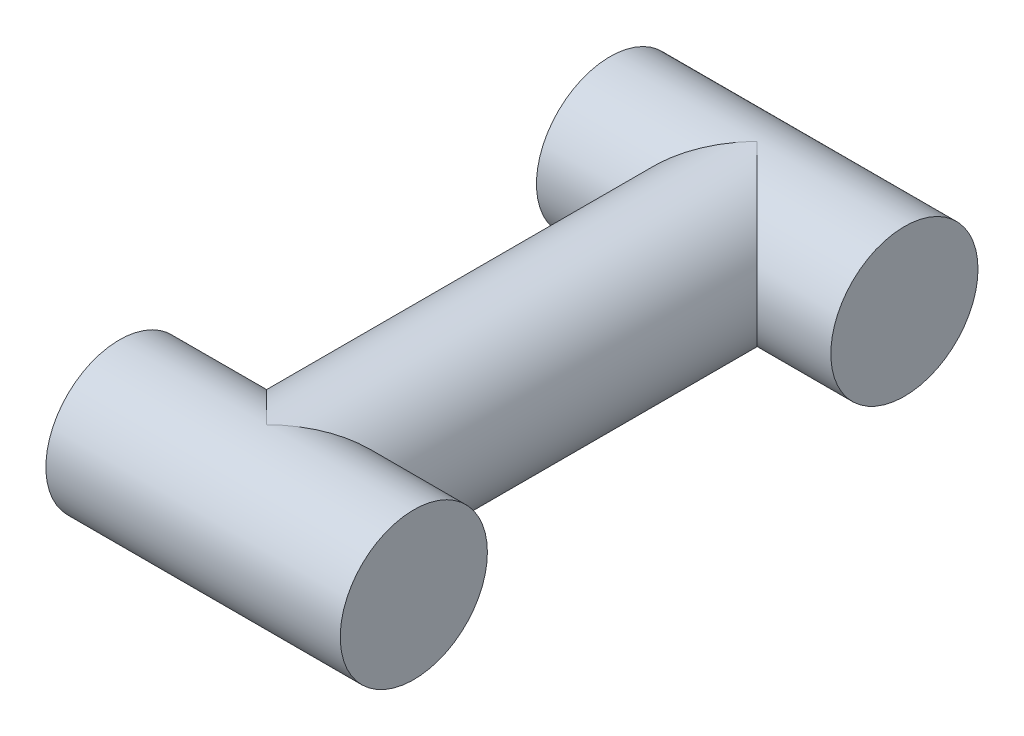
ISO-10303-21;
HEADER;
FILE_DESCRIPTION(('STEP AP214'),'2;1');
FILE_NAME('part.step','',(''),(''),'','','');
FILE_SCHEMA(('AUTOMOTIVE_DESIGN { 1 0 10303 214 1 1 1 1 }'));
ENDSEC;
DATA;
#1=APPLICATION_CONTEXT('core data for automotive mechanical design processes');
#2=APPLICATION_PROTOCOL_DEFINITION('international standard','automotive_design',2000,#1);
#3=PRODUCT_CONTEXT('',#1,'mechanical');
#4=PRODUCT('Part','Part','',(#3));
#5=PRODUCT_RELATED_PRODUCT_CATEGORY('part','',(#4));
#6=PRODUCT_DEFINITION_FORMATION('','',#4);
#7=PRODUCT_DEFINITION_CONTEXT('part definition',#1,'design');
#8=PRODUCT_DEFINITION('design','',#6,#7);
#9=PRODUCT_DEFINITION_SHAPE('','',#8);
#10=(LENGTH_UNIT() NAMED_UNIT(*) SI_UNIT(.MILLI.,.METRE.));
#11=(NAMED_UNIT(*) PLANE_ANGLE_UNIT() SI_UNIT($,.RADIAN.));
#12=(NAMED_UNIT(*) SI_UNIT($,.STERADIAN.) SOLID_ANGLE_UNIT());
#13=UNCERTAINTY_MEASURE_WITH_UNIT(LENGTH_MEASURE(1.E-05),#10,'distance_accuracy_value','');
#14=(GEOMETRIC_REPRESENTATION_CONTEXT(3) GLOBAL_UNCERTAINTY_ASSIGNED_CONTEXT((#13)) GLOBAL_UNIT_ASSIGNED_CONTEXT((#10,
#11,#12)) REPRESENTATION_CONTEXT('',''));
#15=CARTESIAN_POINT('',(0.,0.,0.));
#16=DIRECTION('',(0.,0.,1.));
#17=DIRECTION('',(1.,0.,0.));
#18=AXIS2_PLACEMENT_3D('',#15,#16,#17);
#19=CARTESIAN_POINT('',(0.,0.,100.));
#20=DIRECTION('',(0.,0.,-1.));
#21=DIRECTION('',(-1.,0.,0.));
#22=AXIS2_PLACEMENT_3D('',#19,#20,#21);
#23=CYLINDRICAL_SURFACE('',#22,15.);
#24=CARTESIAN_POINT('',(0.,0.,0.));
#25=DIRECTION('',(-0.707106781186547,0.,0.707106781186548));
#26=DIRECTION('',(-0.707106781186547,0.,-0.707106781186548));
#27=AXIS2_PLACEMENT_3D('',#24,#25,#26);
#28=ELLIPSE('',#27,21.2132034355964,15.);
#29=CARTESIAN_POINT('',(0.,-15.,0.));
#30=VERTEX_POINT('',#29);
#31=CARTESIAN_POINT('',(0.,15.,0.));
#32=VERTEX_POINT('',#31);
#33=EDGE_CURVE('E43',#30,#32,#28,.T.);
#34=ORIENTED_EDGE('',*,*,#33,.T.);
#35=CARTESIAN_POINT('',(0.,0.,0.));
#36=DIRECTION('',(-0.707106781186547,0.,-0.707106781186548));
#37=DIRECTION('',(-0.707106781186547,0.,0.707106781186548));
#38=AXIS2_PLACEMENT_3D('',#35,#36,#37);
#39=ELLIPSE('',#38,21.2132034355964,15.);
#40=EDGE_CURVE('E11',#32,#30,#39,.F.);
#41=ORIENTED_EDGE('',*,*,#40,.T.);
#42=EDGE_LOOP('',(#34,#41));
#43=FACE_BOUND('',#42,.T.);
#44=CARTESIAN_POINT('',(0.,0.,100.));
#45=DIRECTION('',(-0.707106781186547,0.,-0.707106781186547));
#46=DIRECTION('',(0.707106781186547,0.,-0.707106781186547));
#47=AXIS2_PLACEMENT_3D('',#44,#45,#46);
#48=ELLIPSE('',#47,21.2132034355964,15.);
#49=CARTESIAN_POINT('',(0.,-15.,100.));
#50=VERTEX_POINT('',#49);
#51=CARTESIAN_POINT('',(0.,15.,100.));
#52=VERTEX_POINT('',#51);
#53=EDGE_CURVE('E59',#50,#52,#48,.F.);
#54=ORIENTED_EDGE('',*,*,#53,.F.);
#55=CARTESIAN_POINT('',(0.,0.,100.));
#56=DIRECTION('',(0.707106781186547,0.,-0.707106781186547));
#57=DIRECTION('',(-0.707106781186547,0.,-0.707106781186547));
#58=AXIS2_PLACEMENT_3D('',#55,#56,#57);
#59=ELLIPSE('',#58,21.2132034355964,15.);
#60=EDGE_CURVE('E49',#52,#50,#59,.F.);
#61=ORIENTED_EDGE('',*,*,#60,.F.);
#62=EDGE_LOOP('',(#54,#61));
#63=FACE_BOUND('',#62,.T.);
#64=ADVANCED_FACE('F35',(#43,#63),#23,.T.);
#65=CARTESIAN_POINT('',(30.,0.,0.));
#66=DIRECTION('',(-1.,0.,0.));
#67=DIRECTION('',(0.,0.,1.));
#68=AXIS2_PLACEMENT_3D('',#65,#66,#67);
#69=CYLINDRICAL_SURFACE('',#68,15.);
#70=CARTESIAN_POINT('',(-30.,0.,0.));
#71=DIRECTION('',(1.,0.,0.));
#72=DIRECTION('',(0.,0.,-1.));
#73=AXIS2_PLACEMENT_3D('',#70,#71,#72);
#74=CIRCLE('',#73,15.);
#75=CARTESIAN_POINT('',(-30.,0.,-15.));
#76=VERTEX_POINT('',#75);
#77=EDGE_CURVE('E61',#76,#76,#74,.T.);
#78=ORIENTED_EDGE('',*,*,#77,.T.);
#79=EDGE_LOOP('',(#78));
#80=FACE_BOUND('',#79,.T.);
#81=CARTESIAN_POINT('',(30.,0.,0.));
#82=DIRECTION('',(1.,0.,0.));
#83=DIRECTION('',(0.,0.,-1.));
#84=AXIS2_PLACEMENT_3D('',#81,#82,#83);
#85=CIRCLE('',#84,15.);
#86=CARTESIAN_POINT('',(30.,0.,-15.));
#87=VERTEX_POINT('',#86);
#88=EDGE_CURVE('E71',#87,#87,#85,.T.);
#89=ORIENTED_EDGE('',*,*,#88,.F.);
#90=EDGE_LOOP('',(#89));
#91=FACE_BOUND('',#90,.T.);
#92=ORIENTED_EDGE('',*,*,#40,.F.);
#93=ORIENTED_EDGE('',*,*,#33,.F.);
#94=EDGE_LOOP('',(#92,#93));
#95=FACE_BOUND('',#94,.T.);
#96=ADVANCED_FACE('F37',(#80,#91,#95),#69,.T.);
#97=CARTESIAN_POINT('',(30.,0.,0.));
#98=DIRECTION('',(1.,0.,0.));
#99=DIRECTION('',(0.,0.,-1.));
#100=AXIS2_PLACEMENT_3D('',#97,#98,#99);
#101=PLANE('',#100);
#102=ORIENTED_EDGE('',*,*,#88,.T.);
#103=EDGE_LOOP('',(#102));
#104=FACE_BOUND('',#103,.T.);
#105=ADVANCED_FACE('F77',(#104),#101,.T.);
#106=CARTESIAN_POINT('',(-30.,0.,0.));
#107=DIRECTION('',(1.,0.,0.));
#108=DIRECTION('',(0.,0.,-1.));
#109=AXIS2_PLACEMENT_3D('',#106,#107,#108);
#110=PLANE('',#109);
#111=ORIENTED_EDGE('',*,*,#77,.F.);
#112=EDGE_LOOP('',(#111));
#113=FACE_BOUND('',#112,.T.);
#114=ADVANCED_FACE('F83',(#113),#110,.F.);
#115=CARTESIAN_POINT('',(30.,0.,100.));
#116=DIRECTION('',(-1.,0.,0.));
#117=DIRECTION('',(0.,0.,1.));
#118=AXIS2_PLACEMENT_3D('',#115,#116,#117);
#119=CYLINDRICAL_SURFACE('',#118,15.);
#120=CARTESIAN_POINT('',(30.,0.,100.));
#121=DIRECTION('',(1.,0.,0.));
#122=DIRECTION('',(0.,0.,-1.));
#123=AXIS2_PLACEMENT_3D('',#120,#121,#122);
#124=CIRCLE('',#123,15.);
#125=CARTESIAN_POINT('',(30.,0.,85.));
#126=VERTEX_POINT('',#125);
#127=EDGE_CURVE('E64',#126,#126,#124,.T.);
#128=ORIENTED_EDGE('',*,*,#127,.F.);
#129=EDGE_LOOP('',(#128));
#130=FACE_BOUND('',#129,.T.);
#131=CARTESIAN_POINT('',(-30.,0.,100.));
#132=DIRECTION('',(1.,0.,0.));
#133=DIRECTION('',(0.,0.,-1.));
#134=AXIS2_PLACEMENT_3D('',#131,#132,#133);
#135=CIRCLE('',#134,15.);
#136=CARTESIAN_POINT('',(-30.,0.,85.));
#137=VERTEX_POINT('',#136);
#138=EDGE_CURVE('E67',#137,#137,#135,.T.);
#139=ORIENTED_EDGE('',*,*,#138,.T.);
#140=EDGE_LOOP('',(#139));
#141=FACE_BOUND('',#140,.T.);
#142=ORIENTED_EDGE('',*,*,#60,.T.);
#143=ORIENTED_EDGE('',*,*,#53,.T.);
#144=EDGE_LOOP('',(#142,#143));
#145=FACE_BOUND('',#144,.T.);
#146=ADVANCED_FACE('F63',(#130,#141,#145),#119,.T.);
#147=CARTESIAN_POINT('',(30.,0.,100.));
#148=DIRECTION('',(1.,0.,0.));
#149=DIRECTION('',(0.,0.,-1.));
#150=AXIS2_PLACEMENT_3D('',#147,#148,#149);
#151=PLANE('',#150);
#152=ORIENTED_EDGE('',*,*,#127,.T.);
#153=EDGE_LOOP('',(#152));
#154=FACE_BOUND('',#153,.T.);
#155=ADVANCED_FACE('F95',(#154),#151,.T.);
#156=CARTESIAN_POINT('',(-30.,0.,100.));
#157=DIRECTION('',(1.,0.,0.));
#158=DIRECTION('',(0.,0.,-1.));
#159=AXIS2_PLACEMENT_3D('',#156,#157,#158);
#160=PLANE('',#159);
#161=ORIENTED_EDGE('',*,*,#138,.F.);
#162=EDGE_LOOP('',(#161));
#163=FACE_BOUND('',#162,.T.);
#164=ADVANCED_FACE('F99',(#163),#160,.F.);
#165=CLOSED_SHELL('',(#64,#96,#105,#114,#146,#155,#164));
#166=MANIFOLD_SOLID_BREP('B2',#165);
#167=ADVANCED_BREP_SHAPE_REPRESENTATION('',(#18,#166),#14);
#168=SHAPE_DEFINITION_REPRESENTATION(#9,#167);
ENDSEC;
END-ISO-10303-21;
